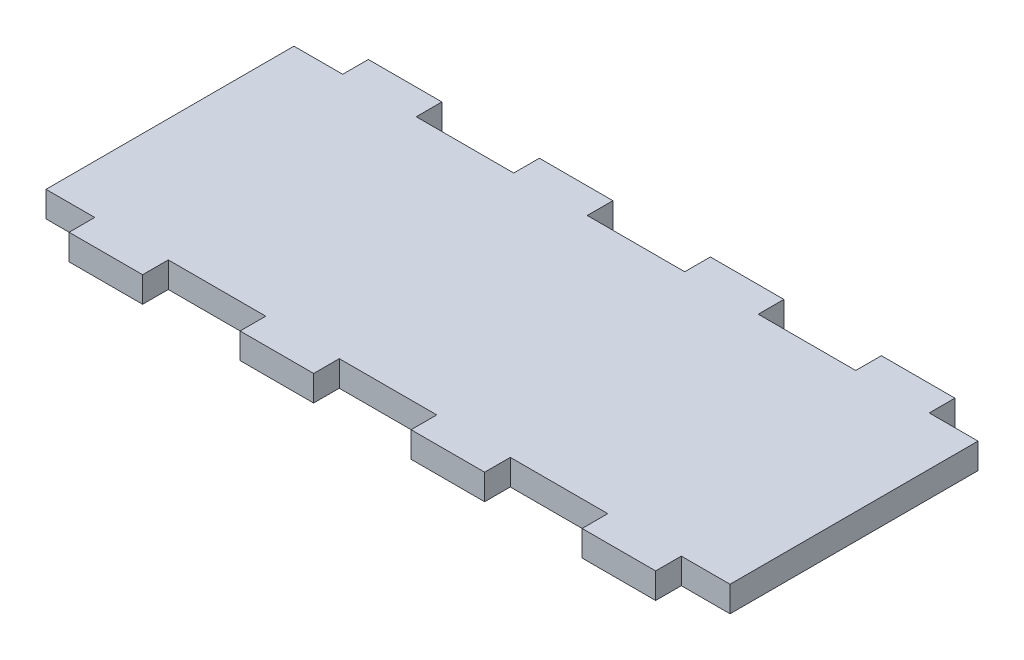
ISO-10303-21;
HEADER;
FILE_DESCRIPTION(('STEP AP214'),'2;1');
FILE_NAME('part.step','',(''),(''),'','','');
FILE_SCHEMA(('AUTOMOTIVE_DESIGN { 1 0 10303 214 1 1 1 1 }'));
ENDSEC;
DATA;
#1=APPLICATION_CONTEXT('core data for automotive mechanical design processes');
#2=APPLICATION_PROTOCOL_DEFINITION('international standard','automotive_design',2000,#1);
#3=PRODUCT_CONTEXT('',#1,'mechanical');
#4=PRODUCT('Part','Part','',(#3));
#5=PRODUCT_RELATED_PRODUCT_CATEGORY('part','',(#4));
#6=PRODUCT_DEFINITION_FORMATION('','',#4);
#7=PRODUCT_DEFINITION_CONTEXT('part definition',#1,'design');
#8=PRODUCT_DEFINITION('design','',#6,#7);
#9=PRODUCT_DEFINITION_SHAPE('','',#8);
#10=(LENGTH_UNIT() NAMED_UNIT(*) SI_UNIT(.MILLI.,.METRE.));
#11=(NAMED_UNIT(*) PLANE_ANGLE_UNIT() SI_UNIT($,.RADIAN.));
#12=(NAMED_UNIT(*) SI_UNIT($,.STERADIAN.) SOLID_ANGLE_UNIT());
#13=UNCERTAINTY_MEASURE_WITH_UNIT(LENGTH_MEASURE(1.E-05),#10,'distance_accuracy_value','');
#14=(GEOMETRIC_REPRESENTATION_CONTEXT(3) GLOBAL_UNCERTAINTY_ASSIGNED_CONTEXT((#13)) GLOBAL_UNIT_ASSIGNED_CONTEXT((#10,
#11,#12)) REPRESENTATION_CONTEXT('',''));
#15=CARTESIAN_POINT('',(0.,0.,0.));
#16=DIRECTION('',(0.,0.,1.));
#17=DIRECTION('',(1.,0.,0.));
#18=AXIS2_PLACEMENT_3D('',#15,#16,#17);
#19=CARTESIAN_POINT('',(0.,3.,0.));
#20=DIRECTION('',(-1.,0.,0.));
#21=DIRECTION('',(0.,0.,1.));
#22=AXIS2_PLACEMENT_3D('',#19,#20,#21);
#23=PLANE('',#22);
#24=DIRECTION('',(0.,0.,-1.));
#25=VECTOR('',#24,1.);
#26=CARTESIAN_POINT('',(0.,0.,0.));
#27=LINE('',#26,#25);
#28=CARTESIAN_POINT('',(0.,0.,-3.));
#29=VERTEX_POINT('',#28);
#30=CARTESIAN_POINT('',(0.,0.,-32.));
#31=VERTEX_POINT('',#30);
#32=EDGE_CURVE('E305',#29,#31,#27,.T.);
#33=ORIENTED_EDGE('',*,*,#32,.F.);
#34=DIRECTION('',(0.,-1.,0.));
#35=VECTOR('',#34,1.);
#36=CARTESIAN_POINT('',(0.,3.,-3.));
#37=LINE('',#36,#35);
#38=CARTESIAN_POINT('',(0.,3.,-3.));
#39=VERTEX_POINT('',#38);
#40=EDGE_CURVE('E11',#39,#29,#37,.T.);
#41=ORIENTED_EDGE('',*,*,#40,.F.);
#42=DIRECTION('',(0.,0.,-1.));
#43=VECTOR('',#42,1.);
#44=CARTESIAN_POINT('',(0.,3.,0.));
#45=LINE('',#44,#43);
#46=CARTESIAN_POINT('',(0.,3.,-32.));
#47=VERTEX_POINT('',#46);
#48=EDGE_CURVE('E392',#39,#47,#45,.T.);
#49=ORIENTED_EDGE('',*,*,#48,.T.);
#50=DIRECTION('',(0.,-1.,0.));
#51=VECTOR('',#50,1.);
#52=CARTESIAN_POINT('',(0.,3.,-32.));
#53=LINE('',#52,#51);
#54=EDGE_CURVE('E175',#47,#31,#53,.T.);
#55=ORIENTED_EDGE('',*,*,#54,.T.);
#56=EDGE_LOOP('',(#33,#41,#49,#55));
#57=FACE_BOUND('',#56,.T.);
#58=ADVANCED_FACE('F41',(#57),#23,.T.);
#59=CARTESIAN_POINT('',(0.,3.,-3.));
#60=DIRECTION('',(0.,0.,1.));
#61=DIRECTION('',(1.,0.,0.));
#62=AXIS2_PLACEMENT_3D('',#59,#60,#61);
#63=PLANE('',#62);
#64=DIRECTION('',(-1.,0.,0.));
#65=VECTOR('',#64,1.);
#66=CARTESIAN_POINT('',(0.,0.,-3.));
#67=LINE('',#66,#65);
#68=CARTESIAN_POINT('',(5.7,0.,-3.));
#69=VERTEX_POINT('',#68);
#70=EDGE_CURVE('E308',#69,#29,#67,.T.);
#71=ORIENTED_EDGE('',*,*,#70,.F.);
#72=DIRECTION('',(0.,-1.,0.));
#73=VECTOR('',#72,1.);
#74=CARTESIAN_POINT('',(5.7,3.,-3.));
#75=LINE('',#74,#73);
#76=CARTESIAN_POINT('',(5.7,3.,-3.));
#77=VERTEX_POINT('',#76);
#78=EDGE_CURVE('E49',#77,#69,#75,.T.);
#79=ORIENTED_EDGE('',*,*,#78,.F.);
#80=DIRECTION('',(-1.,0.,0.));
#81=VECTOR('',#80,1.);
#82=CARTESIAN_POINT('',(0.,3.,-3.));
#83=LINE('',#82,#81);
#84=EDGE_CURVE('E579',#77,#39,#83,.T.);
#85=ORIENTED_EDGE('',*,*,#84,.T.);
#86=ORIENTED_EDGE('',*,*,#40,.T.);
#87=EDGE_LOOP('',(#71,#79,#85,#86));
#88=FACE_BOUND('',#87,.T.);
#89=ADVANCED_FACE('F474',(#88),#63,.T.);
#90=CARTESIAN_POINT('',(5.7,3.,0.));
#91=DIRECTION('',(-1.,0.,0.));
#92=DIRECTION('',(0.,0.,1.));
#93=AXIS2_PLACEMENT_3D('',#90,#91,#92);
#94=PLANE('',#93);
#95=DIRECTION('',(0.,0.,-1.));
#96=VECTOR('',#95,1.);
#97=CARTESIAN_POINT('',(5.7,0.,0.));
#98=LINE('',#97,#96);
#99=CARTESIAN_POINT('',(5.7,0.,0.));
#100=VERTEX_POINT('',#99);
#101=EDGE_CURVE('E311',#100,#69,#98,.T.);
#102=ORIENTED_EDGE('',*,*,#101,.F.);
#103=DIRECTION('',(0.,-1.,0.));
#104=VECTOR('',#103,1.);
#105=CARTESIAN_POINT('',(5.7,3.,0.));
#106=LINE('',#105,#104);
#107=CARTESIAN_POINT('',(5.7,3.,0.));
#108=VERTEX_POINT('',#107);
#109=EDGE_CURVE('E463',#108,#100,#106,.T.);
#110=ORIENTED_EDGE('',*,*,#109,.F.);
#111=DIRECTION('',(0.,0.,-1.));
#112=VECTOR('',#111,1.);
#113=CARTESIAN_POINT('',(5.7,3.,0.));
#114=LINE('',#113,#112);
#115=EDGE_CURVE('E470',#108,#77,#114,.T.);
#116=ORIENTED_EDGE('',*,*,#115,.T.);
#117=ORIENTED_EDGE('',*,*,#78,.T.);
#118=EDGE_LOOP('',(#102,#110,#116,#117));
#119=FACE_BOUND('',#118,.T.);
#120=ADVANCED_FACE('F468',(#119),#94,.T.);
#121=CARTESIAN_POINT('',(0.,3.,0.));
#122=DIRECTION('',(0.,0.,-1.));
#123=DIRECTION('',(-1.,0.,0.));
#124=AXIS2_PLACEMENT_3D('',#121,#122,#123);
#125=PLANE('',#124);
#126=DIRECTION('',(1.,0.,0.));
#127=VECTOR('',#126,1.);
#128=CARTESIAN_POINT('',(0.,0.,0.));
#129=LINE('',#128,#127);
#130=CARTESIAN_POINT('',(14.3,0.,0.));
#131=VERTEX_POINT('',#130);
#132=EDGE_CURVE('E314',#100,#131,#129,.T.);
#133=ORIENTED_EDGE('',*,*,#132,.T.);
#134=DIRECTION('',(0.,-1.,0.));
#135=VECTOR('',#134,1.);
#136=CARTESIAN_POINT('',(14.3,3.,0.));
#137=LINE('',#136,#135);
#138=CARTESIAN_POINT('',(14.3,3.,0.));
#139=VERTEX_POINT('',#138);
#140=EDGE_CURVE('E460',#139,#131,#137,.T.);
#141=ORIENTED_EDGE('',*,*,#140,.F.);
#142=DIRECTION('',(1.,0.,0.));
#143=VECTOR('',#142,1.);
#144=CARTESIAN_POINT('',(0.,3.,0.));
#145=LINE('',#144,#143);
#146=EDGE_CURVE('E491',#108,#139,#145,.T.);
#147=ORIENTED_EDGE('',*,*,#146,.F.);
#148=ORIENTED_EDGE('',*,*,#109,.T.);
#149=EDGE_LOOP('',(#133,#141,#147,#148));
#150=FACE_BOUND('',#149,.T.);
#151=ADVANCED_FACE('F482',(#150),#125,.F.);
#152=CARTESIAN_POINT('',(14.3,3.,0.));
#153=DIRECTION('',(-1.,0.,0.));
#154=DIRECTION('',(0.,0.,1.));
#155=AXIS2_PLACEMENT_3D('',#152,#153,#154);
#156=PLANE('',#155);
#157=DIRECTION('',(0.,0.,-1.));
#158=VECTOR('',#157,1.);
#159=CARTESIAN_POINT('',(14.3,0.,0.));
#160=LINE('',#159,#158);
#161=CARTESIAN_POINT('',(14.3,0.,-3.));
#162=VERTEX_POINT('',#161);
#163=EDGE_CURVE('E316',#131,#162,#160,.T.);
#164=ORIENTED_EDGE('',*,*,#163,.T.);
#165=DIRECTION('',(0.,-1.,0.));
#166=VECTOR('',#165,1.);
#167=CARTESIAN_POINT('',(14.3,3.,-3.));
#168=LINE('',#167,#166);
#169=CARTESIAN_POINT('',(14.3,3.,-3.));
#170=VERTEX_POINT('',#169);
#171=EDGE_CURVE('E457',#170,#162,#168,.T.);
#172=ORIENTED_EDGE('',*,*,#171,.F.);
#173=DIRECTION('',(0.,0.,-1.));
#174=VECTOR('',#173,1.);
#175=CARTESIAN_POINT('',(14.3,3.,0.));
#176=LINE('',#175,#174);
#177=EDGE_CURVE('E488',#139,#170,#176,.T.);
#178=ORIENTED_EDGE('',*,*,#177,.F.);
#179=ORIENTED_EDGE('',*,*,#140,.T.);
#180=EDGE_LOOP('',(#164,#172,#178,#179));
#181=FACE_BOUND('',#180,.T.);
#182=ADVANCED_FACE('F486',(#181),#156,.F.);
#183=CARTESIAN_POINT('',(0.,3.,-3.));
#184=DIRECTION('',(0.,0.,-1.));
#185=DIRECTION('',(-1.,0.,0.));
#186=AXIS2_PLACEMENT_3D('',#183,#184,#185);
#187=PLANE('',#186);
#188=DIRECTION('',(1.,0.,0.));
#189=VECTOR('',#188,1.);
#190=CARTESIAN_POINT('',(0.,0.,-3.));
#191=LINE('',#190,#189);
#192=CARTESIAN_POINT('',(25.7,0.,-3.));
#193=VERTEX_POINT('',#192);
#194=EDGE_CURVE('E320',#162,#193,#191,.T.);
#195=ORIENTED_EDGE('',*,*,#194,.T.);
#196=DIRECTION('',(0.,-1.,0.));
#197=VECTOR('',#196,1.);
#198=CARTESIAN_POINT('',(25.7,3.,-3.));
#199=LINE('',#198,#197);
#200=CARTESIAN_POINT('',(25.7,3.,-3.));
#201=VERTEX_POINT('',#200);
#202=EDGE_CURVE('E455',#201,#193,#199,.T.);
#203=ORIENTED_EDGE('',*,*,#202,.F.);
#204=DIRECTION('',(1.,0.,0.));
#205=VECTOR('',#204,1.);
#206=CARTESIAN_POINT('',(0.,3.,-3.));
#207=LINE('',#206,#205);
#208=EDGE_CURVE('E490',#170,#201,#207,.T.);
#209=ORIENTED_EDGE('',*,*,#208,.F.);
#210=ORIENTED_EDGE('',*,*,#171,.T.);
#211=EDGE_LOOP('',(#195,#203,#209,#210));
#212=FACE_BOUND('',#211,.T.);
#213=ADVANCED_FACE('F855',(#212),#187,.F.);
#214=CARTESIAN_POINT('',(25.7,3.,0.));
#215=DIRECTION('',(-1.,0.,0.));
#216=DIRECTION('',(0.,0.,1.));
#217=AXIS2_PLACEMENT_3D('',#214,#215,#216);
#218=PLANE('',#217);
#219=DIRECTION('',(0.,0.,-1.));
#220=VECTOR('',#219,1.);
#221=CARTESIAN_POINT('',(25.7,0.,0.));
#222=LINE('',#221,#220);
#223=CARTESIAN_POINT('',(25.7,0.,0.));
#224=VERTEX_POINT('',#223);
#225=EDGE_CURVE('E323',#224,#193,#222,.T.);
#226=ORIENTED_EDGE('',*,*,#225,.F.);
#227=DIRECTION('',(0.,-1.,0.));
#228=VECTOR('',#227,1.);
#229=CARTESIAN_POINT('',(25.7,3.,0.));
#230=LINE('',#229,#228);
#231=CARTESIAN_POINT('',(25.7,3.,0.));
#232=VERTEX_POINT('',#231);
#233=EDGE_CURVE('E453',#232,#224,#230,.T.);
#234=ORIENTED_EDGE('',*,*,#233,.F.);
#235=DIRECTION('',(0.,0.,-1.));
#236=VECTOR('',#235,1.);
#237=CARTESIAN_POINT('',(25.7,3.,0.));
#238=LINE('',#237,#236);
#239=EDGE_CURVE('E493',#232,#201,#238,.T.);
#240=ORIENTED_EDGE('',*,*,#239,.T.);
#241=ORIENTED_EDGE('',*,*,#202,.T.);
#242=EDGE_LOOP('',(#226,#234,#240,#241));
#243=FACE_BOUND('',#242,.T.);
#244=ADVANCED_FACE('F846',(#243),#218,.T.);
#245=CARTESIAN_POINT('',(34.3,0.,0.));
#246=VERTEX_POINT('',#245);
#247=EDGE_CURVE('E318',#224,#246,#129,.T.);
#248=ORIENTED_EDGE('',*,*,#247,.T.);
#249=DIRECTION('',(0.,-1.,0.));
#250=VECTOR('',#249,1.);
#251=CARTESIAN_POINT('',(34.3,3.,0.));
#252=LINE('',#251,#250);
#253=CARTESIAN_POINT('',(34.3,3.,0.));
#254=VERTEX_POINT('',#253);
#255=EDGE_CURVE('E450',#254,#246,#252,.T.);
#256=ORIENTED_EDGE('',*,*,#255,.F.);
#257=EDGE_CURVE('E497',#232,#254,#145,.T.);
#258=ORIENTED_EDGE('',*,*,#257,.F.);
#259=ORIENTED_EDGE('',*,*,#233,.T.);
#260=EDGE_LOOP('',(#248,#256,#258,#259));
#261=FACE_BOUND('',#260,.T.);
#262=ADVANCED_FACE('F810',(#261),#125,.F.);
#263=CARTESIAN_POINT('',(34.3,3.,0.));
#264=DIRECTION('',(-1.,0.,0.));
#265=DIRECTION('',(0.,0.,1.));
#266=AXIS2_PLACEMENT_3D('',#263,#264,#265);
#267=PLANE('',#266);
#268=DIRECTION('',(0.,0.,-1.));
#269=VECTOR('',#268,1.);
#270=CARTESIAN_POINT('',(34.3,0.,0.));
#271=LINE('',#270,#269);
#272=CARTESIAN_POINT('',(34.3,0.,-3.));
#273=VERTEX_POINT('',#272);
#274=EDGE_CURVE('E326',#246,#273,#271,.T.);
#275=ORIENTED_EDGE('',*,*,#274,.T.);
#276=DIRECTION('',(0.,-1.,0.));
#277=VECTOR('',#276,1.);
#278=CARTESIAN_POINT('',(34.3,3.,-3.));
#279=LINE('',#278,#277);
#280=CARTESIAN_POINT('',(34.3,3.,-3.));
#281=VERTEX_POINT('',#280);
#282=EDGE_CURVE('E447',#281,#273,#279,.T.);
#283=ORIENTED_EDGE('',*,*,#282,.F.);
#284=DIRECTION('',(0.,0.,-1.));
#285=VECTOR('',#284,1.);
#286=CARTESIAN_POINT('',(34.3,3.,0.));
#287=LINE('',#286,#285);
#288=EDGE_CURVE('E502',#254,#281,#287,.T.);
#289=ORIENTED_EDGE('',*,*,#288,.F.);
#290=ORIENTED_EDGE('',*,*,#255,.T.);
#291=EDGE_LOOP('',(#275,#283,#289,#290));
#292=FACE_BOUND('',#291,.T.);
#293=ADVANCED_FACE('F827',(#292),#267,.F.);
#294=CARTESIAN_POINT('',(0.,3.,-3.));
#295=DIRECTION('',(0.,0.,-1.));
#296=DIRECTION('',(-1.,0.,0.));
#297=AXIS2_PLACEMENT_3D('',#294,#295,#296);
#298=PLANE('',#297);
#299=DIRECTION('',(1.,0.,0.));
#300=VECTOR('',#299,1.);
#301=CARTESIAN_POINT('',(0.,0.,-3.));
#302=LINE('',#301,#300);
#303=CARTESIAN_POINT('',(45.7,0.,-3.));
#304=VERTEX_POINT('',#303);
#305=EDGE_CURVE('E328',#273,#304,#302,.T.);
#306=ORIENTED_EDGE('',*,*,#305,.T.);
#307=DIRECTION('',(0.,-1.,0.));
#308=VECTOR('',#307,1.);
#309=CARTESIAN_POINT('',(45.7,3.,-3.));
#310=LINE('',#309,#308);
#311=CARTESIAN_POINT('',(45.7,3.,-3.));
#312=VERTEX_POINT('',#311);
#313=EDGE_CURVE('E445',#312,#304,#310,.T.);
#314=ORIENTED_EDGE('',*,*,#313,.F.);
#315=DIRECTION('',(1.,0.,0.));
#316=VECTOR('',#315,1.);
#317=CARTESIAN_POINT('',(0.,3.,-3.));
#318=LINE('',#317,#316);
#319=EDGE_CURVE('E504',#281,#312,#318,.T.);
#320=ORIENTED_EDGE('',*,*,#319,.F.);
#321=ORIENTED_EDGE('',*,*,#282,.T.);
#322=EDGE_LOOP('',(#306,#314,#320,#321));
#323=FACE_BOUND('',#322,.T.);
#324=ADVANCED_FACE('F818',(#323),#298,.F.);
#325=CARTESIAN_POINT('',(45.7,3.,1.05702483802853E-13));
#326=DIRECTION('',(-1.,0.,0.));
#327=DIRECTION('',(0.,0.,1.));
#328=AXIS2_PLACEMENT_3D('',#325,#326,#327);
#329=PLANE('',#328);
#330=DIRECTION('',(0.,0.,-1.));
#331=VECTOR('',#330,1.);
#332=CARTESIAN_POINT('',(45.7,0.,1.05702483802853E-13));
#333=LINE('',#332,#331);
#334=CARTESIAN_POINT('',(45.7,0.,0.));
#335=VERTEX_POINT('',#334);
#336=EDGE_CURVE('E331',#335,#304,#333,.T.);
#337=ORIENTED_EDGE('',*,*,#336,.F.);
#338=DIRECTION('',(0.,-1.,0.));
#339=VECTOR('',#338,1.);
#340=CARTESIAN_POINT('',(45.7,3.,0.));
#341=LINE('',#340,#339);
#342=CARTESIAN_POINT('',(45.7,3.,0.));
#343=VERTEX_POINT('',#342);
#344=EDGE_CURVE('E443',#343,#335,#341,.T.);
#345=ORIENTED_EDGE('',*,*,#344,.F.);
#346=DIRECTION('',(0.,0.,-1.));
#347=VECTOR('',#346,1.);
#348=CARTESIAN_POINT('',(45.7,3.,1.05702483802853E-13));
#349=LINE('',#348,#347);
#350=EDGE_CURVE('E506',#343,#312,#349,.T.);
#351=ORIENTED_EDGE('',*,*,#350,.T.);
#352=ORIENTED_EDGE('',*,*,#313,.T.);
#353=EDGE_LOOP('',(#337,#345,#351,#352));
#354=FACE_BOUND('',#353,.T.);
#355=ADVANCED_FACE('F808',(#354),#329,.T.);
#356=CARTESIAN_POINT('',(54.3,0.,0.));
#357=VERTEX_POINT('',#356);
#358=EDGE_CURVE('E334',#335,#357,#129,.T.);
#359=ORIENTED_EDGE('',*,*,#358,.T.);
#360=DIRECTION('',(0.,-1.,0.));
#361=VECTOR('',#360,1.);
#362=CARTESIAN_POINT('',(54.3,3.,0.));
#363=LINE('',#362,#361);
#364=CARTESIAN_POINT('',(54.3,3.,0.));
#365=VERTEX_POINT('',#364);
#366=EDGE_CURVE('E440',#365,#357,#363,.T.);
#367=ORIENTED_EDGE('',*,*,#366,.F.);
#368=EDGE_CURVE('E509',#343,#365,#145,.T.);
#369=ORIENTED_EDGE('',*,*,#368,.F.);
#370=ORIENTED_EDGE('',*,*,#344,.T.);
#371=EDGE_LOOP('',(#359,#367,#369,#370));
#372=FACE_BOUND('',#371,.T.);
#373=ADVANCED_FACE('F772',(#372),#125,.F.);
#374=CARTESIAN_POINT('',(54.3,3.,0.));
#375=DIRECTION('',(-1.,0.,0.));
#376=DIRECTION('',(0.,0.,1.));
#377=AXIS2_PLACEMENT_3D('',#374,#375,#376);
#378=PLANE('',#377);
#379=DIRECTION('',(0.,0.,-1.));
#380=VECTOR('',#379,1.);
#381=CARTESIAN_POINT('',(54.3,0.,0.));
#382=LINE('',#381,#380);
#383=CARTESIAN_POINT('',(54.3,0.,-3.));
#384=VERTEX_POINT('',#383);
#385=EDGE_CURVE('E335',#357,#384,#382,.T.);
#386=ORIENTED_EDGE('',*,*,#385,.T.);
#387=DIRECTION('',(0.,-1.,0.));
#388=VECTOR('',#387,1.);
#389=CARTESIAN_POINT('',(54.3,3.,-3.));
#390=LINE('',#389,#388);
#391=CARTESIAN_POINT('',(54.3,3.,-3.));
#392=VERTEX_POINT('',#391);
#393=EDGE_CURVE('E437',#392,#384,#390,.T.);
#394=ORIENTED_EDGE('',*,*,#393,.F.);
#395=DIRECTION('',(0.,0.,-1.));
#396=VECTOR('',#395,1.);
#397=CARTESIAN_POINT('',(54.3,3.,0.));
#398=LINE('',#397,#396);
#399=EDGE_CURVE('E510',#365,#392,#398,.T.);
#400=ORIENTED_EDGE('',*,*,#399,.F.);
#401=ORIENTED_EDGE('',*,*,#366,.T.);
#402=EDGE_LOOP('',(#386,#394,#400,#401));
#403=FACE_BOUND('',#402,.T.);
#404=ADVANCED_FACE('F789',(#403),#378,.F.);
#405=CARTESIAN_POINT('',(0.,3.,-3.));
#406=DIRECTION('',(0.,0.,-1.));
#407=DIRECTION('',(-1.,0.,0.));
#408=AXIS2_PLACEMENT_3D('',#405,#406,#407);
#409=PLANE('',#408);
#410=DIRECTION('',(1.,0.,0.));
#411=VECTOR('',#410,1.);
#412=CARTESIAN_POINT('',(0.,0.,-3.));
#413=LINE('',#412,#411);
#414=CARTESIAN_POINT('',(65.7,0.,-3.));
#415=VERTEX_POINT('',#414);
#416=EDGE_CURVE('E337',#384,#415,#413,.T.);
#417=ORIENTED_EDGE('',*,*,#416,.T.);
#418=DIRECTION('',(0.,-1.,0.));
#419=VECTOR('',#418,1.);
#420=CARTESIAN_POINT('',(65.7,3.,-3.));
#421=LINE('',#420,#419);
#422=CARTESIAN_POINT('',(65.7,3.,-3.));
#423=VERTEX_POINT('',#422);
#424=EDGE_CURVE('E435',#423,#415,#421,.T.);
#425=ORIENTED_EDGE('',*,*,#424,.F.);
#426=DIRECTION('',(1.,0.,0.));
#427=VECTOR('',#426,1.);
#428=CARTESIAN_POINT('',(0.,3.,-3.));
#429=LINE('',#428,#427);
#430=EDGE_CURVE('E512',#392,#423,#429,.T.);
#431=ORIENTED_EDGE('',*,*,#430,.F.);
#432=ORIENTED_EDGE('',*,*,#393,.T.);
#433=EDGE_LOOP('',(#417,#425,#431,#432));
#434=FACE_BOUND('',#433,.T.);
#435=ADVANCED_FACE('F780',(#434),#409,.F.);
#436=CARTESIAN_POINT('',(65.7,3.,0.));
#437=DIRECTION('',(-1.,0.,0.));
#438=DIRECTION('',(0.,0.,1.));
#439=AXIS2_PLACEMENT_3D('',#436,#437,#438);
#440=PLANE('',#439);
#441=DIRECTION('',(0.,0.,-1.));
#442=VECTOR('',#441,1.);
#443=CARTESIAN_POINT('',(65.7,0.,0.));
#444=LINE('',#443,#442);
#445=CARTESIAN_POINT('',(65.7,0.,0.));
#446=VERTEX_POINT('',#445);
#447=EDGE_CURVE('E340',#446,#415,#444,.T.);
#448=ORIENTED_EDGE('',*,*,#447,.F.);
#449=DIRECTION('',(0.,-1.,0.));
#450=VECTOR('',#449,1.);
#451=CARTESIAN_POINT('',(65.7,3.,0.));
#452=LINE('',#451,#450);
#453=CARTESIAN_POINT('',(65.7,3.,0.));
#454=VERTEX_POINT('',#453);
#455=EDGE_CURVE('E433',#454,#446,#452,.T.);
#456=ORIENTED_EDGE('',*,*,#455,.F.);
#457=DIRECTION('',(0.,0.,-1.));
#458=VECTOR('',#457,1.);
#459=CARTESIAN_POINT('',(65.7,3.,0.));
#460=LINE('',#459,#458);
#461=EDGE_CURVE('E514',#454,#423,#460,.T.);
#462=ORIENTED_EDGE('',*,*,#461,.T.);
#463=ORIENTED_EDGE('',*,*,#424,.T.);
#464=EDGE_LOOP('',(#448,#456,#462,#463));
#465=FACE_BOUND('',#464,.T.);
#466=ADVANCED_FACE('F769',(#465),#440,.T.);
#467=CARTESIAN_POINT('',(74.3,0.,0.));
#468=VERTEX_POINT('',#467);
#469=EDGE_CURVE('E317',#446,#468,#129,.T.);
#470=ORIENTED_EDGE('',*,*,#469,.T.);
#471=DIRECTION('',(0.,-1.,0.));
#472=VECTOR('',#471,1.);
#473=CARTESIAN_POINT('',(74.3,3.,0.));
#474=LINE('',#473,#472);
#475=CARTESIAN_POINT('',(74.3,3.,0.));
#476=VERTEX_POINT('',#475);
#477=EDGE_CURVE('E430',#476,#468,#474,.T.);
#478=ORIENTED_EDGE('',*,*,#477,.F.);
#479=EDGE_CURVE('E496',#454,#476,#145,.T.);
#480=ORIENTED_EDGE('',*,*,#479,.F.);
#481=ORIENTED_EDGE('',*,*,#455,.T.);
#482=EDGE_LOOP('',(#470,#478,#480,#481));
#483=FACE_BOUND('',#482,.T.);
#484=ADVANCED_FACE('F759',(#483),#125,.F.);
#485=CARTESIAN_POINT('',(74.3,3.,0.));
#486=DIRECTION('',(-1.,0.,0.));
#487=DIRECTION('',(0.,0.,1.));
#488=AXIS2_PLACEMENT_3D('',#485,#486,#487);
#489=PLANE('',#488);
#490=DIRECTION('',(0.,0.,-1.));
#491=VECTOR('',#490,1.);
#492=CARTESIAN_POINT('',(74.3,0.,0.));
#493=LINE('',#492,#491);
#494=CARTESIAN_POINT('',(74.3,0.,-3.));
#495=VERTEX_POINT('',#494);
#496=EDGE_CURVE('E343',#468,#495,#493,.T.);
#497=ORIENTED_EDGE('',*,*,#496,.T.);
#498=DIRECTION('',(0.,-1.,0.));
#499=VECTOR('',#498,1.);
#500=CARTESIAN_POINT('',(74.3,3.,-3.));
#501=LINE('',#500,#499);
#502=CARTESIAN_POINT('',(74.3,3.,-3.));
#503=VERTEX_POINT('',#502);
#504=EDGE_CURVE('E427',#503,#495,#501,.T.);
#505=ORIENTED_EDGE('',*,*,#504,.F.);
#506=DIRECTION('',(0.,0.,-1.));
#507=VECTOR('',#506,1.);
#508=CARTESIAN_POINT('',(74.3,3.,0.));
#509=LINE('',#508,#507);
#510=EDGE_CURVE('E517',#476,#503,#509,.T.);
#511=ORIENTED_EDGE('',*,*,#510,.F.);
#512=ORIENTED_EDGE('',*,*,#477,.T.);
#513=EDGE_LOOP('',(#497,#505,#511,#512));
#514=FACE_BOUND('',#513,.T.);
#515=ADVANCED_FACE('F749',(#514),#489,.F.);
#516=CARTESIAN_POINT('',(0.,3.,-3.));
#517=DIRECTION('',(0.,0.,-1.));
#518=DIRECTION('',(-1.,0.,0.));
#519=AXIS2_PLACEMENT_3D('',#516,#517,#518);
#520=PLANE('',#519);
#521=DIRECTION('',(1.,0.,0.));
#522=VECTOR('',#521,1.);
#523=CARTESIAN_POINT('',(0.,0.,-3.));
#524=LINE('',#523,#522);
#525=CARTESIAN_POINT('',(80.,0.,-3.));
#526=VERTEX_POINT('',#525);
#527=EDGE_CURVE('E345',#495,#526,#524,.T.);
#528=ORIENTED_EDGE('',*,*,#527,.T.);
#529=DIRECTION('',(0.,-1.,0.));
#530=VECTOR('',#529,1.);
#531=CARTESIAN_POINT('',(80.,3.,-3.));
#532=LINE('',#531,#530);
#533=CARTESIAN_POINT('',(80.,3.,-3.));
#534=VERTEX_POINT('',#533);
#535=EDGE_CURVE('E424',#534,#526,#532,.T.);
#536=ORIENTED_EDGE('',*,*,#535,.F.);
#537=DIRECTION('',(1.,0.,0.));
#538=VECTOR('',#537,1.);
#539=CARTESIAN_POINT('',(0.,3.,-3.));
#540=LINE('',#539,#538);
#541=EDGE_CURVE('E519',#503,#534,#540,.T.);
#542=ORIENTED_EDGE('',*,*,#541,.F.);
#543=ORIENTED_EDGE('',*,*,#504,.T.);
#544=EDGE_LOOP('',(#528,#536,#542,#543));
#545=FACE_BOUND('',#544,.T.);
#546=ADVANCED_FACE('F740',(#545),#520,.F.);
#547=CARTESIAN_POINT('',(80.,3.,0.));
#548=DIRECTION('',(-1.,0.,0.));
#549=DIRECTION('',(0.,0.,1.));
#550=AXIS2_PLACEMENT_3D('',#547,#548,#549);
#551=PLANE('',#550);
#552=DIRECTION('',(0.,0.,-1.));
#553=VECTOR('',#552,1.);
#554=CARTESIAN_POINT('',(80.,0.,0.));
#555=LINE('',#554,#553);
#556=CARTESIAN_POINT('',(80.,0.,-32.));
#557=VERTEX_POINT('',#556);
#558=EDGE_CURVE('E347',#526,#557,#555,.T.);
#559=ORIENTED_EDGE('',*,*,#558,.T.);
#560=DIRECTION('',(0.,-1.,0.));
#561=VECTOR('',#560,1.);
#562=CARTESIAN_POINT('',(80.,3.,-32.));
#563=LINE('',#562,#561);
#564=CARTESIAN_POINT('',(80.,3.,-32.));
#565=VERTEX_POINT('',#564);
#566=EDGE_CURVE('E422',#565,#557,#563,.T.);
#567=ORIENTED_EDGE('',*,*,#566,.F.);
#568=DIRECTION('',(0.,0.,-1.));
#569=VECTOR('',#568,1.);
#570=CARTESIAN_POINT('',(80.,3.,0.));
#571=LINE('',#570,#569);
#572=EDGE_CURVE('E521',#534,#565,#571,.T.);
#573=ORIENTED_EDGE('',*,*,#572,.F.);
#574=ORIENTED_EDGE('',*,*,#535,.T.);
#575=EDGE_LOOP('',(#559,#567,#573,#574));
#576=FACE_BOUND('',#575,.T.);
#577=ADVANCED_FACE('F731',(#576),#551,.F.);
#578=CARTESIAN_POINT('',(0.,3.,-32.));
#579=DIRECTION('',(0.,0.,-1.));
#580=DIRECTION('',(-1.,0.,0.));
#581=AXIS2_PLACEMENT_3D('',#578,#579,#580);
#582=PLANE('',#581);
#583=DIRECTION('',(1.,0.,0.));
#584=VECTOR('',#583,1.);
#585=CARTESIAN_POINT('',(0.,0.,-32.));
#586=LINE('',#585,#584);
#587=CARTESIAN_POINT('',(74.3,0.,-32.));
#588=VERTEX_POINT('',#587);
#589=EDGE_CURVE('E350',#588,#557,#586,.T.);
#590=ORIENTED_EDGE('',*,*,#589,.F.);
#591=DIRECTION('',(0.,-1.,0.));
#592=VECTOR('',#591,1.);
#593=CARTESIAN_POINT('',(74.3,3.,-32.));
#594=LINE('',#593,#592);
#595=CARTESIAN_POINT('',(74.3,3.,-32.));
#596=VERTEX_POINT('',#595);
#597=EDGE_CURVE('E420',#596,#588,#594,.T.);
#598=ORIENTED_EDGE('',*,*,#597,.F.);
#599=DIRECTION('',(1.,0.,0.));
#600=VECTOR('',#599,1.);
#601=CARTESIAN_POINT('',(0.,3.,-32.));
#602=LINE('',#601,#600);
#603=EDGE_CURVE('E523',#596,#565,#602,.T.);
#604=ORIENTED_EDGE('',*,*,#603,.T.);
#605=ORIENTED_EDGE('',*,*,#566,.T.);
#606=EDGE_LOOP('',(#590,#598,#604,#605));
#607=FACE_BOUND('',#606,.T.);
#608=ADVANCED_FACE('F722',(#607),#582,.T.);
#609=CARTESIAN_POINT('',(74.3,3.,0.));
#610=DIRECTION('',(-1.,0.,0.));
#611=DIRECTION('',(0.,0.,1.));
#612=AXIS2_PLACEMENT_3D('',#609,#610,#611);
#613=PLANE('',#612);
#614=DIRECTION('',(0.,0.,-1.));
#615=VECTOR('',#614,1.);
#616=CARTESIAN_POINT('',(74.3,0.,0.));
#617=LINE('',#616,#615);
#618=CARTESIAN_POINT('',(74.3,0.,-35.));
#619=VERTEX_POINT('',#618);
#620=EDGE_CURVE('E353',#588,#619,#617,.T.);
#621=ORIENTED_EDGE('',*,*,#620,.T.);
#622=DIRECTION('',(0.,-1.,0.));
#623=VECTOR('',#622,1.);
#624=CARTESIAN_POINT('',(74.3,3.,-35.));
#625=LINE('',#624,#623);
#626=CARTESIAN_POINT('',(74.3,3.,-35.));
#627=VERTEX_POINT('',#626);
#628=EDGE_CURVE('E418',#627,#619,#625,.T.);
#629=ORIENTED_EDGE('',*,*,#628,.F.);
#630=DIRECTION('',(0.,0.,-1.));
#631=VECTOR('',#630,1.);
#632=CARTESIAN_POINT('',(74.3,3.,0.));
#633=LINE('',#632,#631);
#634=EDGE_CURVE('E526',#596,#627,#633,.T.);
#635=ORIENTED_EDGE('',*,*,#634,.F.);
#636=ORIENTED_EDGE('',*,*,#597,.T.);
#637=EDGE_LOOP('',(#621,#629,#635,#636));
#638=FACE_BOUND('',#637,.T.);
#639=ADVANCED_FACE('F714',(#638),#613,.F.);
#640=CARTESIAN_POINT('',(0.,3.,-35.));
#641=DIRECTION('',(0.,0.,-1.));
#642=DIRECTION('',(-1.,0.,0.));
#643=AXIS2_PLACEMENT_3D('',#640,#641,#642);
#644=PLANE('',#643);
#645=DIRECTION('',(1.,0.,0.));
#646=VECTOR('',#645,1.);
#647=CARTESIAN_POINT('',(0.,0.,-35.));
#648=LINE('',#647,#646);
#649=CARTESIAN_POINT('',(65.7,0.,-35.));
#650=VERTEX_POINT('',#649);
#651=EDGE_CURVE('E356',#650,#619,#648,.T.);
#652=ORIENTED_EDGE('',*,*,#651,.F.);
#653=DIRECTION('',(0.,-1.,0.));
#654=VECTOR('',#653,1.);
#655=CARTESIAN_POINT('',(65.7,3.,-35.));
#656=LINE('',#655,#654);
#657=CARTESIAN_POINT('',(65.7,3.,-35.));
#658=VERTEX_POINT('',#657);
#659=EDGE_CURVE('E416',#658,#650,#656,.T.);
#660=ORIENTED_EDGE('',*,*,#659,.F.);
#661=DIRECTION('',(1.,0.,0.));
#662=VECTOR('',#661,1.);
#663=CARTESIAN_POINT('',(0.,3.,-35.));
#664=LINE('',#663,#662);
#665=EDGE_CURVE('E298',#658,#627,#664,.T.);
#666=ORIENTED_EDGE('',*,*,#665,.T.);
#667=ORIENTED_EDGE('',*,*,#628,.T.);
#668=EDGE_LOOP('',(#652,#660,#666,#667));
#669=FACE_BOUND('',#668,.T.);
#670=ADVANCED_FACE('F571',(#669),#644,.T.);
#671=CARTESIAN_POINT('',(65.7,3.,0.));
#672=DIRECTION('',(-1.,0.,0.));
#673=DIRECTION('',(0.,0.,1.));
#674=AXIS2_PLACEMENT_3D('',#671,#672,#673);
#675=PLANE('',#674);
#676=DIRECTION('',(0.,0.,-1.));
#677=VECTOR('',#676,1.);
#678=CARTESIAN_POINT('',(65.7,0.,0.));
#679=LINE('',#678,#677);
#680=CARTESIAN_POINT('',(65.7,0.,-32.));
#681=VERTEX_POINT('',#680);
#682=EDGE_CURVE('E359',#681,#650,#679,.T.);
#683=ORIENTED_EDGE('',*,*,#682,.F.);
#684=DIRECTION('',(0.,-1.,0.));
#685=VECTOR('',#684,1.);
#686=CARTESIAN_POINT('',(65.7,3.,-32.));
#687=LINE('',#686,#685);
#688=CARTESIAN_POINT('',(65.7,3.,-32.));
#689=VERTEX_POINT('',#688);
#690=EDGE_CURVE('E414',#689,#681,#687,.T.);
#691=ORIENTED_EDGE('',*,*,#690,.F.);
#692=DIRECTION('',(0.,0.,-1.));
#693=VECTOR('',#692,1.);
#694=CARTESIAN_POINT('',(65.7,3.,0.));
#695=LINE('',#694,#693);
#696=EDGE_CURVE('E529',#689,#658,#695,.T.);
#697=ORIENTED_EDGE('',*,*,#696,.T.);
#698=ORIENTED_EDGE('',*,*,#659,.T.);
#699=EDGE_LOOP('',(#683,#691,#697,#698));
#700=FACE_BOUND('',#699,.T.);
#701=ADVANCED_FACE('F697',(#700),#675,.T.);
#702=CARTESIAN_POINT('',(0.,3.,-32.));
#703=DIRECTION('',(0.,0.,-1.));
#704=DIRECTION('',(-1.,0.,0.));
#705=AXIS2_PLACEMENT_3D('',#702,#703,#704);
#706=PLANE('',#705);
#707=DIRECTION('',(1.,0.,0.));
#708=VECTOR('',#707,1.);
#709=CARTESIAN_POINT('',(0.,0.,-32.));
#710=LINE('',#709,#708);
#711=CARTESIAN_POINT('',(54.3,0.,-32.));
#712=VERTEX_POINT('',#711);
#713=EDGE_CURVE('E363',#712,#681,#710,.T.);
#714=ORIENTED_EDGE('',*,*,#713,.F.);
#715=DIRECTION('',(0.,-1.,0.));
#716=VECTOR('',#715,1.);
#717=CARTESIAN_POINT('',(54.3,3.,-32.));
#718=LINE('',#717,#716);
#719=CARTESIAN_POINT('',(54.3,3.,-32.));
#720=VERTEX_POINT('',#719);
#721=EDGE_CURVE('E412',#720,#712,#718,.T.);
#722=ORIENTED_EDGE('',*,*,#721,.F.);
#723=DIRECTION('',(1.,0.,0.));
#724=VECTOR('',#723,1.);
#725=CARTESIAN_POINT('',(0.,3.,-32.));
#726=LINE('',#725,#724);
#727=EDGE_CURVE('E533',#720,#689,#726,.T.);
#728=ORIENTED_EDGE('',*,*,#727,.T.);
#729=ORIENTED_EDGE('',*,*,#690,.T.);
#730=EDGE_LOOP('',(#714,#722,#728,#729));
#731=FACE_BOUND('',#730,.T.);
#732=ADVANCED_FACE('F688',(#731),#706,.T.);
#733=CARTESIAN_POINT('',(54.3,3.,0.));
#734=DIRECTION('',(-1.,0.,0.));
#735=DIRECTION('',(0.,0.,1.));
#736=AXIS2_PLACEMENT_3D('',#733,#734,#735);
#737=PLANE('',#736);
#738=DIRECTION('',(0.,0.,-1.));
#739=VECTOR('',#738,1.);
#740=CARTESIAN_POINT('',(54.3,0.,0.));
#741=LINE('',#740,#739);
#742=CARTESIAN_POINT('',(54.3,0.,-35.));
#743=VERTEX_POINT('',#742);
#744=EDGE_CURVE('E366',#712,#743,#741,.T.);
#745=ORIENTED_EDGE('',*,*,#744,.T.);
#746=DIRECTION('',(0.,-1.,0.));
#747=VECTOR('',#746,1.);
#748=CARTESIAN_POINT('',(54.3,3.,-35.));
#749=LINE('',#748,#747);
#750=CARTESIAN_POINT('',(54.3,3.,-35.));
#751=VERTEX_POINT('',#750);
#752=EDGE_CURVE('E410',#751,#743,#749,.T.);
#753=ORIENTED_EDGE('',*,*,#752,.F.);
#754=DIRECTION('',(0.,0.,-1.));
#755=VECTOR('',#754,1.);
#756=CARTESIAN_POINT('',(54.3,3.,0.));
#757=LINE('',#756,#755);
#758=EDGE_CURVE('E536',#720,#751,#757,.T.);
#759=ORIENTED_EDGE('',*,*,#758,.F.);
#760=ORIENTED_EDGE('',*,*,#721,.T.);
#761=EDGE_LOOP('',(#745,#753,#759,#760));
#762=FACE_BOUND('',#761,.T.);
#763=ADVANCED_FACE('F680',(#762),#737,.F.);
#764=CARTESIAN_POINT('',(45.7,0.,-35.));
#765=VERTEX_POINT('',#764);
#766=EDGE_CURVE('E360',#765,#743,#648,.T.);
#767=ORIENTED_EDGE('',*,*,#766,.F.);
#768=DIRECTION('',(0.,-1.,0.));
#769=VECTOR('',#768,1.);
#770=CARTESIAN_POINT('',(45.7,3.,-35.));
#771=LINE('',#770,#769);
#772=CARTESIAN_POINT('',(45.7,3.,-35.));
#773=VERTEX_POINT('',#772);
#774=EDGE_CURVE('E408',#773,#765,#771,.T.);
#775=ORIENTED_EDGE('',*,*,#774,.F.);
#776=EDGE_CURVE('E530',#773,#751,#664,.T.);
#777=ORIENTED_EDGE('',*,*,#776,.T.);
#778=ORIENTED_EDGE('',*,*,#752,.T.);
#779=EDGE_LOOP('',(#767,#775,#777,#778));
#780=FACE_BOUND('',#779,.T.);
#781=ADVANCED_FACE('F647',(#780),#644,.T.);
#782=CARTESIAN_POINT('',(45.7000000000001,3.,-1.05702483802854E-13));
#783=DIRECTION('',(-1.,0.,0.));
#784=DIRECTION('',(0.,0.,1.));
#785=AXIS2_PLACEMENT_3D('',#782,#783,#784);
#786=PLANE('',#785);
#787=DIRECTION('',(0.,0.,-1.));
#788=VECTOR('',#787,1.);
#789=CARTESIAN_POINT('',(45.7000000000001,0.,-1.05702483802854E-13));
#790=LINE('',#789,#788);
#791=CARTESIAN_POINT('',(45.7,0.,-32.));
#792=VERTEX_POINT('',#791);
#793=EDGE_CURVE('E369',#792,#765,#790,.T.);
#794=ORIENTED_EDGE('',*,*,#793,.F.);
#795=DIRECTION('',(0.,-1.,0.));
#796=VECTOR('',#795,1.);
#797=CARTESIAN_POINT('',(45.7,3.,-32.));
#798=LINE('',#797,#796);
#799=CARTESIAN_POINT('',(45.7,3.,-32.));
#800=VERTEX_POINT('',#799);
#801=EDGE_CURVE('E406',#800,#792,#798,.T.);
#802=ORIENTED_EDGE('',*,*,#801,.F.);
#803=DIRECTION('',(0.,0.,-1.));
#804=VECTOR('',#803,1.);
#805=CARTESIAN_POINT('',(45.7000000000001,3.,-1.05702483802854E-13));
#806=LINE('',#805,#804);
#807=EDGE_CURVE('E538',#800,#773,#806,.T.);
#808=ORIENTED_EDGE('',*,*,#807,.T.);
#809=ORIENTED_EDGE('',*,*,#774,.T.);
#810=EDGE_LOOP('',(#794,#802,#808,#809));
#811=FACE_BOUND('',#810,.T.);
#812=ADVANCED_FACE('F663',(#811),#786,.T.);
#813=CARTESIAN_POINT('',(0.,3.,-32.));
#814=DIRECTION('',(0.,0.,-1.));
#815=DIRECTION('',(-1.,0.,0.));
#816=AXIS2_PLACEMENT_3D('',#813,#814,#815);
#817=PLANE('',#816);
#818=DIRECTION('',(1.,0.,0.));
#819=VECTOR('',#818,1.);
#820=CARTESIAN_POINT('',(0.,0.,-32.));
#821=LINE('',#820,#819);
#822=CARTESIAN_POINT('',(34.3,0.,-32.));
#823=VERTEX_POINT('',#822);
#824=EDGE_CURVE('E372',#823,#792,#821,.T.);
#825=ORIENTED_EDGE('',*,*,#824,.F.);
#826=DIRECTION('',(0.,-1.,0.));
#827=VECTOR('',#826,1.);
#828=CARTESIAN_POINT('',(34.3,3.,-32.));
#829=LINE('',#828,#827);
#830=CARTESIAN_POINT('',(34.3,3.,-32.));
#831=VERTEX_POINT('',#830);
#832=EDGE_CURVE('E404',#831,#823,#829,.T.);
#833=ORIENTED_EDGE('',*,*,#832,.F.);
#834=DIRECTION('',(1.,0.,0.));
#835=VECTOR('',#834,1.);
#836=CARTESIAN_POINT('',(0.,3.,-32.));
#837=LINE('',#836,#835);
#838=EDGE_CURVE('E541',#831,#800,#837,.T.);
#839=ORIENTED_EDGE('',*,*,#838,.T.);
#840=ORIENTED_EDGE('',*,*,#801,.T.);
#841=EDGE_LOOP('',(#825,#833,#839,#840));
#842=FACE_BOUND('',#841,.T.);
#843=ADVANCED_FACE('F654',(#842),#817,.T.);
#844=CARTESIAN_POINT('',(34.2999999999999,3.,0.));
#845=DIRECTION('',(-1.,0.,0.));
#846=DIRECTION('',(0.,0.,1.));
#847=AXIS2_PLACEMENT_3D('',#844,#845,#846);
#848=PLANE('',#847);
#849=DIRECTION('',(0.,0.,-1.));
#850=VECTOR('',#849,1.);
#851=CARTESIAN_POINT('',(34.2999999999999,0.,0.));
#852=LINE('',#851,#850);
#853=CARTESIAN_POINT('',(34.3,0.,-35.));
#854=VERTEX_POINT('',#853);
#855=EDGE_CURVE('E375',#823,#854,#852,.T.);
#856=ORIENTED_EDGE('',*,*,#855,.T.);
#857=DIRECTION('',(0.,-1.,0.));
#858=VECTOR('',#857,1.);
#859=CARTESIAN_POINT('',(34.3,3.,-35.));
#860=LINE('',#859,#858);
#861=CARTESIAN_POINT('',(34.3,3.,-35.));
#862=VERTEX_POINT('',#861);
#863=EDGE_CURVE('E402',#862,#854,#860,.T.);
#864=ORIENTED_EDGE('',*,*,#863,.F.);
#865=DIRECTION('',(0.,0.,-1.));
#866=VECTOR('',#865,1.);
#867=CARTESIAN_POINT('',(34.2999999999999,3.,0.));
#868=LINE('',#867,#866);
#869=EDGE_CURVE('E544',#831,#862,#868,.T.);
#870=ORIENTED_EDGE('',*,*,#869,.F.);
#871=ORIENTED_EDGE('',*,*,#832,.T.);
#872=EDGE_LOOP('',(#856,#864,#870,#871));
#873=FACE_BOUND('',#872,.T.);
#874=ADVANCED_FACE('F645',(#873),#848,.F.);
#875=CARTESIAN_POINT('',(25.7,0.,-35.));
#876=VERTEX_POINT('',#875);
#877=EDGE_CURVE('E378',#876,#854,#648,.T.);
#878=ORIENTED_EDGE('',*,*,#877,.F.);
#879=DIRECTION('',(0.,-1.,0.));
#880=VECTOR('',#879,1.);
#881=CARTESIAN_POINT('',(25.7,3.,-35.));
#882=LINE('',#881,#880);
#883=CARTESIAN_POINT('',(25.7,3.,-35.));
#884=VERTEX_POINT('',#883);
#885=EDGE_CURVE('E400',#884,#876,#882,.T.);
#886=ORIENTED_EDGE('',*,*,#885,.F.);
#887=EDGE_CURVE('E297',#884,#862,#664,.T.);
#888=ORIENTED_EDGE('',*,*,#887,.T.);
#889=ORIENTED_EDGE('',*,*,#863,.T.);
#890=EDGE_LOOP('',(#878,#886,#888,#889));
#891=FACE_BOUND('',#890,.T.);
#892=ADVANCED_FACE('F572',(#891),#644,.T.);
#893=CARTESIAN_POINT('',(25.7,3.,0.));
#894=DIRECTION('',(-1.,0.,0.));
#895=DIRECTION('',(0.,0.,1.));
#896=AXIS2_PLACEMENT_3D('',#893,#894,#895);
#897=PLANE('',#896);
#898=DIRECTION('',(0.,0.,-1.));
#899=VECTOR('',#898,1.);
#900=CARTESIAN_POINT('',(25.7,0.,0.));
#901=LINE('',#900,#899);
#902=CARTESIAN_POINT('',(25.7,0.,-32.));
#903=VERTEX_POINT('',#902);
#904=EDGE_CURVE('E379',#903,#876,#901,.T.);
#905=ORIENTED_EDGE('',*,*,#904,.F.);
#906=DIRECTION('',(0.,-1.,0.));
#907=VECTOR('',#906,1.);
#908=CARTESIAN_POINT('',(25.7,3.,-32.));
#909=LINE('',#908,#907);
#910=CARTESIAN_POINT('',(25.7,3.,-32.));
#911=VERTEX_POINT('',#910);
#912=EDGE_CURVE('E398',#911,#903,#909,.T.);
#913=ORIENTED_EDGE('',*,*,#912,.F.);
#914=DIRECTION('',(0.,0.,-1.));
#915=VECTOR('',#914,1.);
#916=CARTESIAN_POINT('',(25.7,3.,0.));
#917=LINE('',#916,#915);
#918=EDGE_CURVE('E546',#911,#884,#917,.T.);
#919=ORIENTED_EDGE('',*,*,#918,.T.);
#920=ORIENTED_EDGE('',*,*,#885,.T.);
#921=EDGE_LOOP('',(#905,#913,#919,#920));
#922=FACE_BOUND('',#921,.T.);
#923=ADVANCED_FACE('F558',(#922),#897,.T.);
#924=CARTESIAN_POINT('',(0.,3.,-32.));
#925=DIRECTION('',(0.,0.,-1.));
#926=DIRECTION('',(-1.,0.,0.));
#927=AXIS2_PLACEMENT_3D('',#924,#925,#926);
#928=PLANE('',#927);
#929=DIRECTION('',(1.,0.,0.));
#930=VECTOR('',#929,1.);
#931=CARTESIAN_POINT('',(0.,0.,-32.));
#932=LINE('',#931,#930);
#933=CARTESIAN_POINT('',(14.3,0.,-32.));
#934=VERTEX_POINT('',#933);
#935=EDGE_CURVE('E382',#934,#903,#932,.T.);
#936=ORIENTED_EDGE('',*,*,#935,.F.);
#937=DIRECTION('',(0.,-1.,0.));
#938=VECTOR('',#937,1.);
#939=CARTESIAN_POINT('',(14.3,3.,-32.));
#940=LINE('',#939,#938);
#941=CARTESIAN_POINT('',(14.3,3.,-32.));
#942=VERTEX_POINT('',#941);
#943=EDGE_CURVE('E396',#942,#934,#940,.T.);
#944=ORIENTED_EDGE('',*,*,#943,.F.);
#945=DIRECTION('',(1.,0.,0.));
#946=VECTOR('',#945,1.);
#947=CARTESIAN_POINT('',(0.,3.,-32.));
#948=LINE('',#947,#946);
#949=EDGE_CURVE('E548',#942,#911,#948,.T.);
#950=ORIENTED_EDGE('',*,*,#949,.T.);
#951=ORIENTED_EDGE('',*,*,#912,.T.);
#952=EDGE_LOOP('',(#936,#944,#950,#951));
#953=FACE_BOUND('',#952,.T.);
#954=ADVANCED_FACE('F552',(#953),#928,.T.);
#955=CARTESIAN_POINT('',(14.3,3.,0.));
#956=DIRECTION('',(-1.,0.,0.));
#957=DIRECTION('',(0.,0.,1.));
#958=AXIS2_PLACEMENT_3D('',#955,#956,#957);
#959=PLANE('',#958);
#960=DIRECTION('',(0.,0.,-1.));
#961=VECTOR('',#960,1.);
#962=CARTESIAN_POINT('',(14.3,0.,0.));
#963=LINE('',#962,#961);
#964=CARTESIAN_POINT('',(14.3,0.,-35.));
#965=VERTEX_POINT('',#964);
#966=EDGE_CURVE('E385',#934,#965,#963,.T.);
#967=ORIENTED_EDGE('',*,*,#966,.T.);
#968=DIRECTION('',(0.,-1.,0.));
#969=VECTOR('',#968,1.);
#970=CARTESIAN_POINT('',(14.3,3.,-35.));
#971=LINE('',#970,#969);
#972=CARTESIAN_POINT('',(14.3,3.,-35.));
#973=VERTEX_POINT('',#972);
#974=EDGE_CURVE('E288',#973,#965,#971,.T.);
#975=ORIENTED_EDGE('',*,*,#974,.F.);
#976=DIRECTION('',(0.,0.,-1.));
#977=VECTOR('',#976,1.);
#978=CARTESIAN_POINT('',(14.3,3.,0.));
#979=LINE('',#978,#977);
#980=EDGE_CURVE('E294',#942,#973,#979,.T.);
#981=ORIENTED_EDGE('',*,*,#980,.F.);
#982=ORIENTED_EDGE('',*,*,#943,.T.);
#983=EDGE_LOOP('',(#967,#975,#981,#982));
#984=FACE_BOUND('',#983,.T.);
#985=ADVANCED_FACE('F563',(#984),#959,.F.);
#986=CARTESIAN_POINT('',(5.7,0.,-35.));
#987=VERTEX_POINT('',#986);
#988=EDGE_CURVE('E283',#987,#965,#648,.T.);
#989=ORIENTED_EDGE('',*,*,#988,.F.);
#990=DIRECTION('',(0.,-1.,0.));
#991=VECTOR('',#990,1.);
#992=CARTESIAN_POINT('',(5.7,3.,-35.));
#993=LINE('',#992,#991);
#994=CARTESIAN_POINT('',(5.7,3.,-35.));
#995=VERTEX_POINT('',#994);
#996=EDGE_CURVE('E278',#995,#987,#993,.T.);
#997=ORIENTED_EDGE('',*,*,#996,.F.);
#998=EDGE_CURVE('E281',#995,#973,#664,.T.);
#999=ORIENTED_EDGE('',*,*,#998,.T.);
#1000=ORIENTED_EDGE('',*,*,#974,.T.);
#1001=EDGE_LOOP('',(#989,#997,#999,#1000));
#1002=FACE_BOUND('',#1001,.T.);
#1003=ADVANCED_FACE('F280',(#1002),#644,.T.);
#1004=CARTESIAN_POINT('',(5.70000000000004,3.,0.));
#1005=DIRECTION('',(-1.,0.,0.));
#1006=DIRECTION('',(0.,0.,1.));
#1007=AXIS2_PLACEMENT_3D('',#1004,#1005,#1006);
#1008=PLANE('',#1007);
#1009=DIRECTION('',(0.,0.,-1.));
#1010=VECTOR('',#1009,1.);
#1011=CARTESIAN_POINT('',(5.70000000000004,0.,0.));
#1012=LINE('',#1011,#1010);
#1013=CARTESIAN_POINT('',(5.7,0.,-32.));
#1014=VERTEX_POINT('',#1013);
#1015=EDGE_CURVE('E388',#1014,#987,#1012,.T.);
#1016=ORIENTED_EDGE('',*,*,#1015,.F.);
#1017=DIRECTION('',(0.,-1.,0.));
#1018=VECTOR('',#1017,1.);
#1019=CARTESIAN_POINT('',(5.7,3.,-32.));
#1020=LINE('',#1019,#1018);
#1021=CARTESIAN_POINT('',(5.7,3.,-32.));
#1022=VERTEX_POINT('',#1021);
#1023=EDGE_CURVE('E168',#1022,#1014,#1020,.T.);
#1024=ORIENTED_EDGE('',*,*,#1023,.F.);
#1025=DIRECTION('',(0.,0.,-1.));
#1026=VECTOR('',#1025,1.);
#1027=CARTESIAN_POINT('',(5.70000000000004,3.,0.));
#1028=LINE('',#1027,#1026);
#1029=EDGE_CURVE('E291',#1022,#995,#1028,.T.);
#1030=ORIENTED_EDGE('',*,*,#1029,.T.);
#1031=ORIENTED_EDGE('',*,*,#996,.T.);
#1032=EDGE_LOOP('',(#1016,#1024,#1030,#1031));
#1033=FACE_BOUND('',#1032,.T.);
#1034=ADVANCED_FACE('F299',(#1033),#1008,.T.);
#1035=CARTESIAN_POINT('',(0.,3.,-32.));
#1036=DIRECTION('',(0.,0.,1.));
#1037=DIRECTION('',(1.,0.,0.));
#1038=AXIS2_PLACEMENT_3D('',#1035,#1036,#1037);
#1039=PLANE('',#1038);
#1040=DIRECTION('',(-1.,0.,0.));
#1041=VECTOR('',#1040,1.);
#1042=CARTESIAN_POINT('',(0.,0.,-32.));
#1043=LINE('',#1042,#1041);
#1044=EDGE_CURVE('E390',#1014,#31,#1043,.T.);
#1045=ORIENTED_EDGE('',*,*,#1044,.T.);
#1046=ORIENTED_EDGE('',*,*,#54,.F.);
#1047=DIRECTION('',(-1.,0.,0.));
#1048=VECTOR('',#1047,1.);
#1049=CARTESIAN_POINT('',(0.,3.,-32.));
#1050=LINE('',#1049,#1048);
#1051=EDGE_CURVE('E57',#1022,#47,#1050,.T.);
#1052=ORIENTED_EDGE('',*,*,#1051,.F.);
#1053=ORIENTED_EDGE('',*,*,#1023,.T.);
#1054=EDGE_LOOP('',(#1045,#1046,#1052,#1053));
#1055=FACE_BOUND('',#1054,.T.);
#1056=ADVANCED_FACE('F578',(#1055),#1039,.F.);
#1057=CARTESIAN_POINT('',(0.,3.,0.));
#1058=DIRECTION('',(0.,1.,0.));
#1059=DIRECTION('',(0.,0.,1.));
#1060=AXIS2_PLACEMENT_3D('',#1057,#1058,#1059);
#1061=PLANE('',#1060);
#1062=ORIENTED_EDGE('',*,*,#48,.F.);
#1063=ORIENTED_EDGE('',*,*,#84,.F.);
#1064=ORIENTED_EDGE('',*,*,#115,.F.);
#1065=ORIENTED_EDGE('',*,*,#146,.T.);
#1066=ORIENTED_EDGE('',*,*,#177,.T.);
#1067=ORIENTED_EDGE('',*,*,#208,.T.);
#1068=ORIENTED_EDGE('',*,*,#239,.F.);
#1069=ORIENTED_EDGE('',*,*,#257,.T.);
#1070=ORIENTED_EDGE('',*,*,#288,.T.);
#1071=ORIENTED_EDGE('',*,*,#319,.T.);
#1072=ORIENTED_EDGE('',*,*,#350,.F.);
#1073=ORIENTED_EDGE('',*,*,#368,.T.);
#1074=ORIENTED_EDGE('',*,*,#399,.T.);
#1075=ORIENTED_EDGE('',*,*,#430,.T.);
#1076=ORIENTED_EDGE('',*,*,#461,.F.);
#1077=ORIENTED_EDGE('',*,*,#479,.T.);
#1078=ORIENTED_EDGE('',*,*,#510,.T.);
#1079=ORIENTED_EDGE('',*,*,#541,.T.);
#1080=ORIENTED_EDGE('',*,*,#572,.T.);
#1081=ORIENTED_EDGE('',*,*,#603,.F.);
#1082=ORIENTED_EDGE('',*,*,#634,.T.);
#1083=ORIENTED_EDGE('',*,*,#665,.F.);
#1084=ORIENTED_EDGE('',*,*,#696,.F.);
#1085=ORIENTED_EDGE('',*,*,#727,.F.);
#1086=ORIENTED_EDGE('',*,*,#758,.T.);
#1087=ORIENTED_EDGE('',*,*,#776,.F.);
#1088=ORIENTED_EDGE('',*,*,#807,.F.);
#1089=ORIENTED_EDGE('',*,*,#838,.F.);
#1090=ORIENTED_EDGE('',*,*,#869,.T.);
#1091=ORIENTED_EDGE('',*,*,#887,.F.);
#1092=ORIENTED_EDGE('',*,*,#918,.F.);
#1093=ORIENTED_EDGE('',*,*,#949,.F.);
#1094=ORIENTED_EDGE('',*,*,#980,.T.);
#1095=ORIENTED_EDGE('',*,*,#998,.F.);
#1096=ORIENTED_EDGE('',*,*,#1029,.F.);
#1097=ORIENTED_EDGE('',*,*,#1051,.T.);
#1098=EDGE_LOOP('',(#1062,#1063,#1064,#1065,#1066,#1067,#1068,#1069,#1070,#1071,#1072,#1073,
#1074,#1075,#1076,#1077,#1078,#1079,#1080,#1081,#1082,#1083,#1084,#1085,#1086,#1087,#1088,#1089,
#1090,#1091,#1092,#1093,#1094,#1095,#1096,#1097));
#1099=FACE_BOUND('',#1098,.T.);
#1100=ADVANCED_FACE('F290',(#1099),#1061,.T.);
#1101=CARTESIAN_POINT('',(0.,0.,0.));
#1102=DIRECTION('',(0.,1.,0.));
#1103=DIRECTION('',(0.,0.,1.));
#1104=AXIS2_PLACEMENT_3D('',#1101,#1102,#1103);
#1105=PLANE('',#1104);
#1106=ORIENTED_EDGE('',*,*,#32,.T.);
#1107=ORIENTED_EDGE('',*,*,#1044,.F.);
#1108=ORIENTED_EDGE('',*,*,#1015,.T.);
#1109=ORIENTED_EDGE('',*,*,#988,.T.);
#1110=ORIENTED_EDGE('',*,*,#966,.F.);
#1111=ORIENTED_EDGE('',*,*,#935,.T.);
#1112=ORIENTED_EDGE('',*,*,#904,.T.);
#1113=ORIENTED_EDGE('',*,*,#877,.T.);
#1114=ORIENTED_EDGE('',*,*,#855,.F.);
#1115=ORIENTED_EDGE('',*,*,#824,.T.);
#1116=ORIENTED_EDGE('',*,*,#793,.T.);
#1117=ORIENTED_EDGE('',*,*,#766,.T.);
#1118=ORIENTED_EDGE('',*,*,#744,.F.);
#1119=ORIENTED_EDGE('',*,*,#713,.T.);
#1120=ORIENTED_EDGE('',*,*,#682,.T.);
#1121=ORIENTED_EDGE('',*,*,#651,.T.);
#1122=ORIENTED_EDGE('',*,*,#620,.F.);
#1123=ORIENTED_EDGE('',*,*,#589,.T.);
#1124=ORIENTED_EDGE('',*,*,#558,.F.);
#1125=ORIENTED_EDGE('',*,*,#527,.F.);
#1126=ORIENTED_EDGE('',*,*,#496,.F.);
#1127=ORIENTED_EDGE('',*,*,#469,.F.);
#1128=ORIENTED_EDGE('',*,*,#447,.T.);
#1129=ORIENTED_EDGE('',*,*,#416,.F.);
#1130=ORIENTED_EDGE('',*,*,#385,.F.);
#1131=ORIENTED_EDGE('',*,*,#358,.F.);
#1132=ORIENTED_EDGE('',*,*,#336,.T.);
#1133=ORIENTED_EDGE('',*,*,#305,.F.);
#1134=ORIENTED_EDGE('',*,*,#274,.F.);
#1135=ORIENTED_EDGE('',*,*,#247,.F.);
#1136=ORIENTED_EDGE('',*,*,#225,.T.);
#1137=ORIENTED_EDGE('',*,*,#194,.F.);
#1138=ORIENTED_EDGE('',*,*,#163,.F.);
#1139=ORIENTED_EDGE('',*,*,#132,.F.);
#1140=ORIENTED_EDGE('',*,*,#101,.T.);
#1141=ORIENTED_EDGE('',*,*,#70,.T.);
#1142=EDGE_LOOP('',(#1106,#1107,#1108,#1109,#1110,#1111,#1112,#1113,#1114,#1115,#1116,#1117,
#1118,#1119,#1120,#1121,#1122,#1123,#1124,#1125,#1126,#1127,#1128,#1129,#1130,#1131,#1132,#1133,
#1134,#1135,#1136,#1137,#1138,#1139,#1140,#1141));
#1143=FACE_BOUND('',#1142,.T.);
#1144=ADVANCED_FACE('F477',(#1143),#1105,.F.);
#1145=CLOSED_SHELL('',(#58,#89,#120,#151,#182,#213,#244,#262,#293,#324,#355,#373,#404,#435,#466,
#484,#515,#546,#577,#608,#639,#670,#701,#732,#763,#781,#812,#843,#874,#892,#923,#954,#985,#1003,
#1034,#1056,#1100,#1144));
#1146=MANIFOLD_SOLID_BREP('B2',#1145);
#1147=ADVANCED_BREP_SHAPE_REPRESENTATION('',(#18,#1146),#14);
#1148=SHAPE_DEFINITION_REPRESENTATION(#9,#1147);
ENDSEC;
END-ISO-10303-21;
